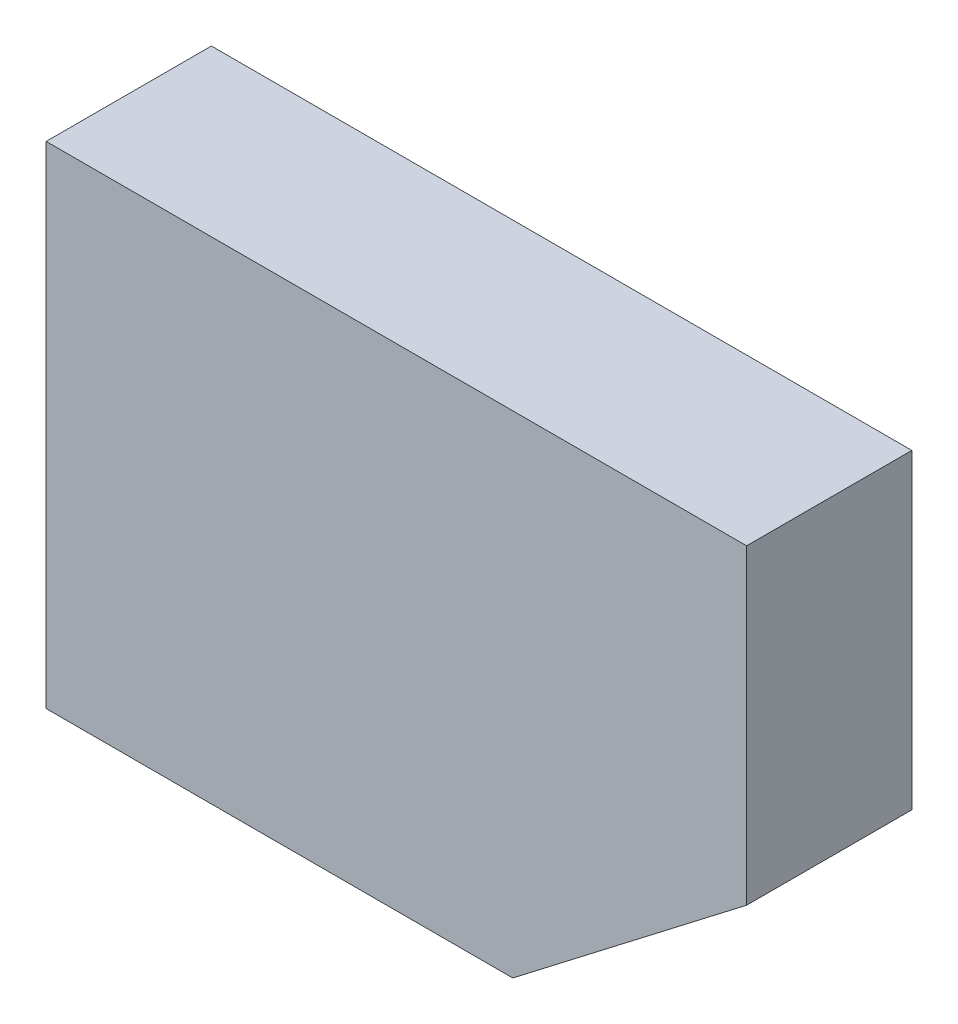
ISO-10303-21;
HEADER;
FILE_DESCRIPTION(('STEP AP214'),'2;1');
FILE_NAME('part.step','',(''),(''),'','','');
FILE_SCHEMA(('AUTOMOTIVE_DESIGN { 1 0 10303 214 1 1 1 1 }'));
ENDSEC;
DATA;
#1=APPLICATION_CONTEXT('core data for automotive mechanical design processes');
#2=APPLICATION_PROTOCOL_DEFINITION('international standard','automotive_design',2000,#1);
#3=PRODUCT_CONTEXT('',#1,'mechanical');
#4=PRODUCT('Part','Part','',(#3));
#5=PRODUCT_RELATED_PRODUCT_CATEGORY('part','',(#4));
#6=PRODUCT_DEFINITION_FORMATION('','',#4);
#7=PRODUCT_DEFINITION_CONTEXT('part definition',#1,'design');
#8=PRODUCT_DEFINITION('design','',#6,#7);
#9=PRODUCT_DEFINITION_SHAPE('','',#8);
#10=(LENGTH_UNIT() NAMED_UNIT(*) SI_UNIT(.MILLI.,.METRE.));
#11=(NAMED_UNIT(*) PLANE_ANGLE_UNIT() SI_UNIT($,.RADIAN.));
#12=(NAMED_UNIT(*) SI_UNIT($,.STERADIAN.) SOLID_ANGLE_UNIT());
#13=UNCERTAINTY_MEASURE_WITH_UNIT(LENGTH_MEASURE(1.E-05),#10,'distance_accuracy_value','');
#14=(GEOMETRIC_REPRESENTATION_CONTEXT(3) GLOBAL_UNCERTAINTY_ASSIGNED_CONTEXT((#13)) GLOBAL_UNIT_ASSIGNED_CONTEXT((#10,
#11,#12)) REPRESENTATION_CONTEXT('',''));
#15=CARTESIAN_POINT('',(0.,0.,0.));
#16=DIRECTION('',(0.,0.,1.));
#17=DIRECTION('',(1.,0.,0.));
#18=AXIS2_PLACEMENT_3D('',#15,#16,#17);
#19=CARTESIAN_POINT('',(-210.000000638584,-2.22044604925031E-13,8.));
#20=DIRECTION('',(0.,-1.,0.));
#21=DIRECTION('',(1.,0.,0.));
#22=AXIS2_PLACEMENT_3D('',#19,#20,#21);
#23=PLANE('',#22);
#24=DIRECTION('',(-1.,0.,0.));
#25=VECTOR('',#24,1.);
#26=CARTESIAN_POINT('',(-210.000000638584,-2.22044604925031E-13,8.));
#27=LINE('',#26,#25);
#28=CARTESIAN_POINT('',(-176.085718778575,0.,8.));
#29=VERTEX_POINT('',#28);
#30=CARTESIAN_POINT('',(-210.000000638584,-2.22044604925031E-13,8.));
#31=VERTEX_POINT('',#30);
#32=EDGE_CURVE('E87',#29,#31,#27,.T.);
#33=ORIENTED_EDGE('',*,*,#32,.F.);
#34=DIRECTION('',(0.,0.,-1.));
#35=VECTOR('',#34,1.);
#36=CARTESIAN_POINT('',(-176.085718778575,0.,8.));
#37=LINE('',#36,#35);
#38=CARTESIAN_POINT('',(-176.085718778575,0.,0.));
#39=VERTEX_POINT('',#38);
#40=EDGE_CURVE('E74',#29,#39,#37,.T.);
#41=ORIENTED_EDGE('',*,*,#40,.T.);
#42=DIRECTION('',(-1.,0.,0.));
#43=VECTOR('',#42,1.);
#44=CARTESIAN_POINT('',(-210.000000638584,-2.22044604925031E-13,0.));
#45=LINE('',#44,#43);
#46=CARTESIAN_POINT('',(-210.000000638584,-2.22044604925031E-13,0.));
#47=VERTEX_POINT('',#46);
#48=EDGE_CURVE('E108',#39,#47,#45,.T.);
#49=ORIENTED_EDGE('',*,*,#48,.T.);
#50=DIRECTION('',(0.,0.,-1.));
#51=VECTOR('',#50,1.);
#52=CARTESIAN_POINT('',(-210.000000638584,-2.22044604925031E-13,8.));
#53=LINE('',#52,#51);
#54=EDGE_CURVE('E95',#31,#47,#53,.T.);
#55=ORIENTED_EDGE('',*,*,#54,.F.);
#56=EDGE_LOOP('',(#33,#41,#49,#55));
#57=FACE_BOUND('',#56,.T.);
#58=ADVANCED_FACE('F31',(#57),#23,.F.);
#59=CARTESIAN_POINT('',(-210.000000638584,-2.22044604925031E-13,8.));
#60=DIRECTION('',(1.,0.,0.));
#61=DIRECTION('',(0.,1.,0.));
#62=AXIS2_PLACEMENT_3D('',#59,#60,#61);
#63=PLANE('',#62);
#64=DIRECTION('',(0.,-1.,0.));
#65=VECTOR('',#64,1.);
#66=CARTESIAN_POINT('',(-210.000000638584,-2.22044604925031E-13,0.));
#67=LINE('',#66,#65);
#68=CARTESIAN_POINT('',(-210.000000638584,-23.7827889164919,0.));
#69=VERTEX_POINT('',#68);
#70=EDGE_CURVE('E101',#47,#69,#67,.T.);
#71=ORIENTED_EDGE('',*,*,#70,.T.);
#72=DIRECTION('',(0.,0.,1.));
#73=VECTOR('',#72,1.);
#74=CARTESIAN_POINT('',(-210.000000638583,-23.7827889164919,0.));
#75=LINE('',#74,#73);
#76=CARTESIAN_POINT('',(-210.000000638583,-23.7827889164919,8.));
#77=VERTEX_POINT('',#76);
#78=EDGE_CURVE('E52',#69,#77,#75,.T.);
#79=ORIENTED_EDGE('',*,*,#78,.T.);
#80=DIRECTION('',(0.,-1.,0.));
#81=VECTOR('',#80,1.);
#82=CARTESIAN_POINT('',(-210.000000638584,-2.22044604925031E-13,8.));
#83=LINE('',#82,#81);
#84=EDGE_CURVE('E96',#31,#77,#83,.T.);
#85=ORIENTED_EDGE('',*,*,#84,.F.);
#86=ORIENTED_EDGE('',*,*,#54,.T.);
#87=EDGE_LOOP('',(#71,#79,#85,#86));
#88=FACE_BOUND('',#87,.T.);
#89=ADVANCED_FACE('F121',(#88),#63,.F.);
#90=CARTESIAN_POINT('',(-156.500000574667,0.,8.));
#91=DIRECTION('',(-0.609830116501307,0.792532162759343,0.));
#92=DIRECTION('',(-0.792532162759343,-0.609830116501307,0.));
#93=AXIS2_PLACEMENT_3D('',#90,#91,#92);
#94=PLANE('',#93);
#95=DIRECTION('',(0.792532162759343,0.609830116501307,0.));
#96=VECTOR('',#95,1.);
#97=CARTESIAN_POINT('',(-156.500000574667,0.,0.));
#98=LINE('',#97,#96);
#99=CARTESIAN_POINT('',(-187.407993844291,-23.7827889164919,0.));
#100=VERTEX_POINT('',#99);
#101=CARTESIAN_POINT('',(-176.085718778575,-15.0706323040139,0.));
#102=VERTEX_POINT('',#101);
#103=EDGE_CURVE('E97',#100,#102,#98,.T.);
#104=ORIENTED_EDGE('',*,*,#103,.T.);
#105=DIRECTION('',(0.,0.,1.));
#106=VECTOR('',#105,1.);
#107=CARTESIAN_POINT('',(-176.085718778575,-15.0706323040139,8.));
#108=LINE('',#107,#106);
#109=CARTESIAN_POINT('',(-176.085718778575,-15.0706323040139,8.));
#110=VERTEX_POINT('',#109);
#111=EDGE_CURVE('E44',#102,#110,#108,.T.);
#112=ORIENTED_EDGE('',*,*,#111,.T.);
#113=DIRECTION('',(0.792532162759343,0.609830116501307,0.));
#114=VECTOR('',#113,1.);
#115=CARTESIAN_POINT('',(-156.500000574667,0.,8.));
#116=LINE('',#115,#114);
#117=CARTESIAN_POINT('',(-187.407993844291,-23.7827889164919,8.));
#118=VERTEX_POINT('',#117);
#119=EDGE_CURVE('E91',#118,#110,#116,.T.);
#120=ORIENTED_EDGE('',*,*,#119,.F.);
#121=DIRECTION('',(0.,0.,-1.));
#122=VECTOR('',#121,1.);
#123=CARTESIAN_POINT('',(-187.40799384429,-23.7827889164919,8.));
#124=LINE('',#123,#122);
#125=EDGE_CURVE('E104',#118,#100,#124,.T.);
#126=ORIENTED_EDGE('',*,*,#125,.T.);
#127=EDGE_LOOP('',(#104,#112,#120,#126));
#128=FACE_BOUND('',#127,.T.);
#129=ADVANCED_FACE('F118',(#128),#94,.F.);
#130=CARTESIAN_POINT('',(-210.000000638584,-2.22044604925031E-13,8.));
#131=DIRECTION('',(0.,0.,-1.));
#132=DIRECTION('',(-1.,0.,0.));
#133=AXIS2_PLACEMENT_3D('',#130,#131,#132);
#134=PLANE('',#133);
#135=ORIENTED_EDGE('',*,*,#119,.T.);
#136=DIRECTION('',(0.,-1.,0.));
#137=VECTOR('',#136,1.);
#138=CARTESIAN_POINT('',(-176.085718778575,-16.8553493872029,8.));
#139=LINE('',#138,#137);
#140=EDGE_CURVE('E77',#29,#110,#139,.T.);
#141=ORIENTED_EDGE('',*,*,#140,.F.);
#142=ORIENTED_EDGE('',*,*,#32,.T.);
#143=ORIENTED_EDGE('',*,*,#84,.T.);
#144=DIRECTION('',(-1.,0.,0.));
#145=VECTOR('',#144,1.);
#146=CARTESIAN_POINT('',(-210.000000638583,-23.7827889164919,8.));
#147=LINE('',#146,#145);
#148=EDGE_CURVE('E81',#118,#77,#147,.T.);
#149=ORIENTED_EDGE('',*,*,#148,.F.);
#150=EDGE_LOOP('',(#135,#141,#142,#143,#149));
#151=FACE_BOUND('',#150,.T.);
#152=ADVANCED_FACE('F85',(#151),#134,.F.);
#153=CARTESIAN_POINT('',(-210.000000638584,-2.22044604925031E-13,0.));
#154=DIRECTION('',(0.,0.,-1.));
#155=DIRECTION('',(-1.,0.,0.));
#156=AXIS2_PLACEMENT_3D('',#153,#154,#155);
#157=PLANE('',#156);
#158=DIRECTION('',(0.,1.,0.));
#159=VECTOR('',#158,1.);
#160=CARTESIAN_POINT('',(-176.085718778575,-2.22044604925031E-13,0.));
#161=LINE('',#160,#159);
#162=EDGE_CURVE('E11',#102,#39,#161,.T.);
#163=ORIENTED_EDGE('',*,*,#162,.F.);
#164=ORIENTED_EDGE('',*,*,#103,.F.);
#165=DIRECTION('',(1.,0.,0.));
#166=VECTOR('',#165,1.);
#167=CARTESIAN_POINT('',(-210.000000638584,-23.7827889164919,0.));
#168=LINE('',#167,#166);
#169=EDGE_CURVE('E38',#69,#100,#168,.T.);
#170=ORIENTED_EDGE('',*,*,#169,.F.);
#171=ORIENTED_EDGE('',*,*,#70,.F.);
#172=ORIENTED_EDGE('',*,*,#48,.F.);
#173=EDGE_LOOP('',(#163,#164,#170,#171,#172));
#174=FACE_BOUND('',#173,.T.);
#175=ADVANCED_FACE('F119',(#174),#157,.T.);
#176=CARTESIAN_POINT('',(-210.000000638583,-23.7827889164919,0.));
#177=DIRECTION('',(0.,1.,0.));
#178=DIRECTION('',(0.,0.,1.));
#179=AXIS2_PLACEMENT_3D('',#176,#177,#178);
#180=PLANE('',#179);
#181=ORIENTED_EDGE('',*,*,#148,.T.);
#182=ORIENTED_EDGE('',*,*,#78,.F.);
#183=ORIENTED_EDGE('',*,*,#169,.T.);
#184=ORIENTED_EDGE('',*,*,#125,.F.);
#185=EDGE_LOOP('',(#181,#182,#183,#184));
#186=FACE_BOUND('',#185,.T.);
#187=ADVANCED_FACE('F113',(#186),#180,.F.);
#188=CARTESIAN_POINT('',(-176.085718778575,-16.8553493872029,0.));
#189=DIRECTION('',(-1.,0.,0.));
#190=DIRECTION('',(0.,0.,1.));
#191=AXIS2_PLACEMENT_3D('',#188,#189,#190);
#192=PLANE('',#191);
#193=ORIENTED_EDGE('',*,*,#140,.T.);
#194=ORIENTED_EDGE('',*,*,#111,.F.);
#195=ORIENTED_EDGE('',*,*,#162,.T.);
#196=ORIENTED_EDGE('',*,*,#40,.F.);
#197=EDGE_LOOP('',(#193,#194,#195,#196));
#198=FACE_BOUND('',#197,.T.);
#199=ADVANCED_FACE('F76',(#198),#192,.F.);
#200=CLOSED_SHELL('',(#58,#89,#129,#152,#175,#187,#199));
#201=MANIFOLD_SOLID_BREP('B2',#200);
#202=ADVANCED_BREP_SHAPE_REPRESENTATION('',(#18,#201),#14);
#203=SHAPE_DEFINITION_REPRESENTATION(#9,#202);
ENDSEC;
END-ISO-10303-21;
